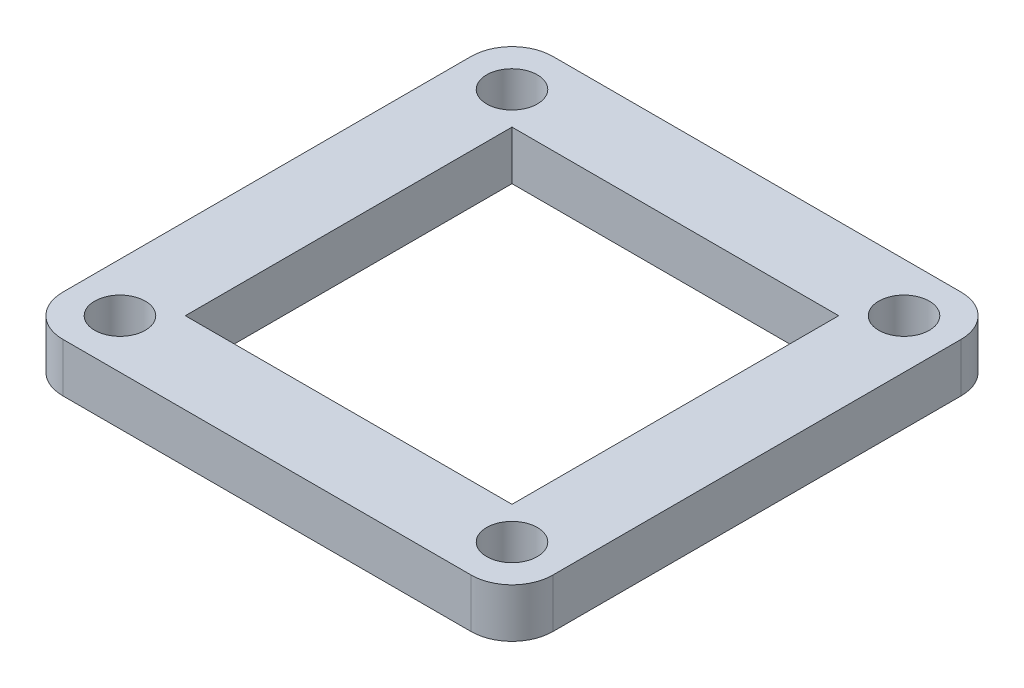
ISO-10303-21;
HEADER;
FILE_DESCRIPTION(('STEP AP214'),'2;1');
FILE_NAME('part.step','',(''),(''),'','','');
FILE_SCHEMA(('AUTOMOTIVE_DESIGN { 1 0 10303 214 1 1 1 1 }'));
ENDSEC;
DATA;
#1=APPLICATION_CONTEXT('core data for automotive mechanical design processes');
#2=APPLICATION_PROTOCOL_DEFINITION('international standard','automotive_design',2000,#1);
#3=PRODUCT_CONTEXT('',#1,'mechanical');
#4=PRODUCT('Part','Part','',(#3));
#5=PRODUCT_RELATED_PRODUCT_CATEGORY('part','',(#4));
#6=PRODUCT_DEFINITION_FORMATION('','',#4);
#7=PRODUCT_DEFINITION_CONTEXT('part definition',#1,'design');
#8=PRODUCT_DEFINITION('design','',#6,#7);
#9=PRODUCT_DEFINITION_SHAPE('','',#8);
#10=(LENGTH_UNIT() NAMED_UNIT(*) SI_UNIT(.MILLI.,.METRE.));
#11=(NAMED_UNIT(*) PLANE_ANGLE_UNIT() SI_UNIT($,.RADIAN.));
#12=(NAMED_UNIT(*) SI_UNIT($,.STERADIAN.) SOLID_ANGLE_UNIT());
#13=UNCERTAINTY_MEASURE_WITH_UNIT(LENGTH_MEASURE(1.E-05),#10,'distance_accuracy_value','');
#14=(GEOMETRIC_REPRESENTATION_CONTEXT(3) GLOBAL_UNCERTAINTY_ASSIGNED_CONTEXT((#13)) GLOBAL_UNIT_ASSIGNED_CONTEXT((#10,
#11,#12)) REPRESENTATION_CONTEXT('',''));
#15=CARTESIAN_POINT('',(0.,0.,0.));
#16=DIRECTION('',(0.,0.,1.));
#17=DIRECTION('',(1.,0.,0.));
#18=AXIS2_PLACEMENT_3D('',#15,#16,#17);
#19=CARTESIAN_POINT('',(0.,3.,0.));
#20=DIRECTION('',(0.,-1.,0.));
#21=DIRECTION('',(0.,0.,-1.));
#22=AXIS2_PLACEMENT_3D('',#19,#20,#21);
#23=PLANE('',#22);
#24=CARTESIAN_POINT('',(-12.,3.,12.0000000000002));
#25=DIRECTION('',(0.,1.,0.));
#26=DIRECTION('',(0.,0.,1.));
#27=AXIS2_PLACEMENT_3D('',#24,#25,#26);
#28=CIRCLE('',#27,1.55);
#29=CARTESIAN_POINT('',(-12.,3.,13.5500000000002));
#30=VERTEX_POINT('',#29);
#31=EDGE_CURVE('E166',#30,#30,#28,.T.);
#32=ORIENTED_EDGE('',*,*,#31,.F.);
#33=EDGE_LOOP('',(#32));
#34=FACE_BOUND('',#33,.T.);
#35=CARTESIAN_POINT('',(-12.,3.,-11.9999999999998));
#36=DIRECTION('',(0.,1.,0.));
#37=DIRECTION('',(0.,0.,1.));
#38=AXIS2_PLACEMENT_3D('',#35,#36,#37);
#39=CIRCLE('',#38,1.55);
#40=CARTESIAN_POINT('',(-12.,3.,-10.4499999999998));
#41=VERTEX_POINT('',#40);
#42=EDGE_CURVE('E172',#41,#41,#39,.T.);
#43=ORIENTED_EDGE('',*,*,#42,.F.);
#44=EDGE_LOOP('',(#43));
#45=FACE_BOUND('',#44,.T.);
#46=CARTESIAN_POINT('',(12.,3.,12.));
#47=DIRECTION('',(0.,1.,0.));
#48=DIRECTION('',(0.,0.,1.));
#49=AXIS2_PLACEMENT_3D('',#46,#47,#48);
#50=CIRCLE('',#49,1.55);
#51=CARTESIAN_POINT('',(12.,3.,13.55));
#52=VERTEX_POINT('',#51);
#53=EDGE_CURVE('E178',#52,#52,#50,.T.);
#54=ORIENTED_EDGE('',*,*,#53,.F.);
#55=EDGE_LOOP('',(#54));
#56=FACE_BOUND('',#55,.T.);
#57=CARTESIAN_POINT('',(12.,3.,-12.));
#58=DIRECTION('',(0.,1.,0.));
#59=DIRECTION('',(0.,0.,1.));
#60=AXIS2_PLACEMENT_3D('',#57,#58,#59);
#61=CIRCLE('',#60,1.55);
#62=CARTESIAN_POINT('',(12.,3.,-10.45));
#63=VERTEX_POINT('',#62);
#64=EDGE_CURVE('E184',#63,#63,#61,.T.);
#65=ORIENTED_EDGE('',*,*,#64,.F.);
#66=EDGE_LOOP('',(#65));
#67=FACE_BOUND('',#66,.T.);
#68=DIRECTION('',(-1.,0.,0.));
#69=VECTOR('',#68,1.);
#70=CARTESIAN_POINT('',(-15.,3.,-15.));
#71=LINE('',#70,#69);
#72=CARTESIAN_POINT('',(12.5,3.,-15.));
#73=VERTEX_POINT('',#72);
#74=CARTESIAN_POINT('',(-12.5,3.,-15.));
#75=VERTEX_POINT('',#74);
#76=EDGE_CURVE('E193',#73,#75,#71,.T.);
#77=ORIENTED_EDGE('',*,*,#76,.T.);
#78=CARTESIAN_POINT('',(-12.5,3.,-12.5));
#79=DIRECTION('',(0.,-1.,0.));
#80=DIRECTION('',(0.,0.,-1.));
#81=AXIS2_PLACEMENT_3D('',#78,#79,#80);
#82=CIRCLE('',#81,2.5);
#83=CARTESIAN_POINT('',(-15.,3.,-12.5));
#84=VERTEX_POINT('',#83);
#85=EDGE_CURVE('E233',#75,#84,#82,.F.);
#86=ORIENTED_EDGE('',*,*,#85,.T.);
#87=DIRECTION('',(0.,0.,1.));
#88=VECTOR('',#87,1.);
#89=CARTESIAN_POINT('',(-15.,3.,15.));
#90=LINE('',#89,#88);
#91=CARTESIAN_POINT('',(-15.,3.,12.5));
#92=VERTEX_POINT('',#91);
#93=EDGE_CURVE('E197',#84,#92,#90,.T.);
#94=ORIENTED_EDGE('',*,*,#93,.T.);
#95=CARTESIAN_POINT('',(-12.5,3.,12.5));
#96=DIRECTION('',(0.,-1.,0.));
#97=DIRECTION('',(0.,0.,-1.));
#98=AXIS2_PLACEMENT_3D('',#95,#96,#97);
#99=CIRCLE('',#98,2.5);
#100=CARTESIAN_POINT('',(-12.5,3.,15.));
#101=VERTEX_POINT('',#100);
#102=EDGE_CURVE('E55',#92,#101,#99,.F.);
#103=ORIENTED_EDGE('',*,*,#102,.T.);
#104=DIRECTION('',(1.,0.,0.));
#105=VECTOR('',#104,1.);
#106=CARTESIAN_POINT('',(-15.,3.,15.));
#107=LINE('',#106,#105);
#108=CARTESIAN_POINT('',(12.5,3.,15.));
#109=VERTEX_POINT('',#108);
#110=EDGE_CURVE('E199',#101,#109,#107,.T.);
#111=ORIENTED_EDGE('',*,*,#110,.T.);
#112=CARTESIAN_POINT('',(12.5,3.,12.5));
#113=DIRECTION('',(0.,-1.,0.));
#114=DIRECTION('',(0.,0.,-1.));
#115=AXIS2_PLACEMENT_3D('',#112,#113,#114);
#116=CIRCLE('',#115,2.5);
#117=CARTESIAN_POINT('',(15.,3.,12.5));
#118=VERTEX_POINT('',#117);
#119=EDGE_CURVE('E230',#109,#118,#116,.F.);
#120=ORIENTED_EDGE('',*,*,#119,.T.);
#121=DIRECTION('',(0.,0.,-1.));
#122=VECTOR('',#121,1.);
#123=CARTESIAN_POINT('',(15.,3.,15.));
#124=LINE('',#123,#122);
#125=CARTESIAN_POINT('',(15.,3.,-12.5));
#126=VERTEX_POINT('',#125);
#127=EDGE_CURVE('E190',#118,#126,#124,.T.);
#128=ORIENTED_EDGE('',*,*,#127,.T.);
#129=CARTESIAN_POINT('',(12.5,3.,-12.5));
#130=DIRECTION('',(0.,-1.,0.));
#131=DIRECTION('',(0.,0.,-1.));
#132=AXIS2_PLACEMENT_3D('',#129,#130,#131);
#133=CIRCLE('',#132,2.5);
#134=EDGE_CURVE('E228',#126,#73,#133,.F.);
#135=ORIENTED_EDGE('',*,*,#134,.T.);
#136=EDGE_LOOP('',(#77,#86,#94,#103,#111,#120,#128,#135));
#137=FACE_BOUND('',#136,.T.);
#138=DIRECTION('',(0.,0.,-1.));
#139=VECTOR('',#138,1.);
#140=CARTESIAN_POINT('',(10.,3.,-10.));
#141=LINE('',#140,#139);
#142=CARTESIAN_POINT('',(10.,3.,10.));
#143=VERTEX_POINT('',#142);
#144=CARTESIAN_POINT('',(10.,3.,-10.));
#145=VERTEX_POINT('',#144);
#146=EDGE_CURVE('E125',#143,#145,#141,.T.);
#147=ORIENTED_EDGE('',*,*,#146,.F.);
#148=DIRECTION('',(1.,0.,0.));
#149=VECTOR('',#148,1.);
#150=CARTESIAN_POINT('',(-10.,3.,10.));
#151=LINE('',#150,#149);
#152=CARTESIAN_POINT('',(-10.,3.,10.));
#153=VERTEX_POINT('',#152);
#154=EDGE_CURVE('E150',#153,#143,#151,.T.);
#155=ORIENTED_EDGE('',*,*,#154,.F.);
#156=DIRECTION('',(0.,0.,1.));
#157=VECTOR('',#156,1.);
#158=CARTESIAN_POINT('',(-10.,3.,-10.));
#159=LINE('',#158,#157);
#160=CARTESIAN_POINT('',(-10.,3.,-10.));
#161=VERTEX_POINT('',#160);
#162=EDGE_CURVE('E148',#161,#153,#159,.T.);
#163=ORIENTED_EDGE('',*,*,#162,.F.);
#164=DIRECTION('',(-1.,0.,0.));
#165=VECTOR('',#164,1.);
#166=CARTESIAN_POINT('',(-10.,3.,-10.));
#167=LINE('',#166,#165);
#168=EDGE_CURVE('E135',#145,#161,#167,.T.);
#169=ORIENTED_EDGE('',*,*,#168,.F.);
#170=EDGE_LOOP('',(#147,#155,#163,#169));
#171=FACE_BOUND('',#170,.T.);
#172=ADVANCED_FACE('F33',(#34,#45,#56,#67,#137,#171),#23,.F.);
#173=CARTESIAN_POINT('',(0.,0.,0.));
#174=DIRECTION('',(0.,-1.,0.));
#175=DIRECTION('',(0.,0.,-1.));
#176=AXIS2_PLACEMENT_3D('',#173,#174,#175);
#177=PLANE('',#176);
#178=CARTESIAN_POINT('',(-12.,0.,-11.9999999999998));
#179=DIRECTION('',(0.,1.,0.));
#180=DIRECTION('',(0.,0.,1.));
#181=AXIS2_PLACEMENT_3D('',#178,#179,#180);
#182=CIRCLE('',#181,1.55);
#183=CARTESIAN_POINT('',(-12.,0.,-10.4499999999998));
#184=VERTEX_POINT('',#183);
#185=EDGE_CURVE('E169',#184,#184,#182,.T.);
#186=ORIENTED_EDGE('',*,*,#185,.T.);
#187=EDGE_LOOP('',(#186));
#188=FACE_BOUND('',#187,.T.);
#189=CARTESIAN_POINT('',(12.,0.,-12.));
#190=DIRECTION('',(0.,1.,0.));
#191=DIRECTION('',(0.,0.,1.));
#192=AXIS2_PLACEMENT_3D('',#189,#190,#191);
#193=CIRCLE('',#192,1.55);
#194=CARTESIAN_POINT('',(12.,0.,-10.45));
#195=VERTEX_POINT('',#194);
#196=EDGE_CURVE('E181',#195,#195,#193,.T.);
#197=ORIENTED_EDGE('',*,*,#196,.T.);
#198=EDGE_LOOP('',(#197));
#199=FACE_BOUND('',#198,.T.);
#200=DIRECTION('',(0.,0.,1.));
#201=VECTOR('',#200,1.);
#202=CARTESIAN_POINT('',(-15.,0.,15.));
#203=LINE('',#202,#201);
#204=CARTESIAN_POINT('',(-15.,0.,-12.5));
#205=VERTEX_POINT('',#204);
#206=CARTESIAN_POINT('',(-15.,0.,12.5));
#207=VERTEX_POINT('',#206);
#208=EDGE_CURVE('E207',#205,#207,#203,.T.);
#209=ORIENTED_EDGE('',*,*,#208,.F.);
#210=CARTESIAN_POINT('',(-12.5,0.,-12.5));
#211=DIRECTION('',(0.,-1.,0.));
#212=DIRECTION('',(0.,0.,-1.));
#213=AXIS2_PLACEMENT_3D('',#210,#211,#212);
#214=CIRCLE('',#213,2.5);
#215=CARTESIAN_POINT('',(-12.5,0.,-15.));
#216=VERTEX_POINT('',#215);
#217=EDGE_CURVE('E221',#205,#216,#214,.T.);
#218=ORIENTED_EDGE('',*,*,#217,.T.);
#219=DIRECTION('',(-1.,0.,0.));
#220=VECTOR('',#219,1.);
#221=CARTESIAN_POINT('',(-15.,0.,-15.));
#222=LINE('',#221,#220);
#223=CARTESIAN_POINT('',(12.5,0.,-15.));
#224=VERTEX_POINT('',#223);
#225=EDGE_CURVE('E204',#224,#216,#222,.T.);
#226=ORIENTED_EDGE('',*,*,#225,.F.);
#227=CARTESIAN_POINT('',(12.5,0.,-12.5));
#228=DIRECTION('',(0.,-1.,0.));
#229=DIRECTION('',(0.,0.,-1.));
#230=AXIS2_PLACEMENT_3D('',#227,#228,#229);
#231=CIRCLE('',#230,2.5);
#232=CARTESIAN_POINT('',(15.,0.,-12.5));
#233=VERTEX_POINT('',#232);
#234=EDGE_CURVE('E215',#224,#233,#231,.T.);
#235=ORIENTED_EDGE('',*,*,#234,.T.);
#236=DIRECTION('',(0.,0.,-1.));
#237=VECTOR('',#236,1.);
#238=CARTESIAN_POINT('',(15.,0.,15.));
#239=LINE('',#238,#237);
#240=CARTESIAN_POINT('',(15.,0.,12.5));
#241=VERTEX_POINT('',#240);
#242=EDGE_CURVE('E187',#241,#233,#239,.T.);
#243=ORIENTED_EDGE('',*,*,#242,.F.);
#244=CARTESIAN_POINT('',(12.5,0.,12.5));
#245=DIRECTION('',(0.,-1.,0.));
#246=DIRECTION('',(0.,0.,-1.));
#247=AXIS2_PLACEMENT_3D('',#244,#245,#246);
#248=CIRCLE('',#247,2.5);
#249=CARTESIAN_POINT('',(12.5,0.,15.));
#250=VERTEX_POINT('',#249);
#251=EDGE_CURVE('E217',#241,#250,#248,.T.);
#252=ORIENTED_EDGE('',*,*,#251,.T.);
#253=DIRECTION('',(1.,0.,0.));
#254=VECTOR('',#253,1.);
#255=CARTESIAN_POINT('',(-15.,0.,15.));
#256=LINE('',#255,#254);
#257=CARTESIAN_POINT('',(-12.5,0.,15.));
#258=VERTEX_POINT('',#257);
#259=EDGE_CURVE('E194',#258,#250,#256,.T.);
#260=ORIENTED_EDGE('',*,*,#259,.F.);
#261=CARTESIAN_POINT('',(-12.5,0.,12.5));
#262=DIRECTION('',(0.,-1.,0.));
#263=DIRECTION('',(0.,0.,-1.));
#264=AXIS2_PLACEMENT_3D('',#261,#262,#263);
#265=CIRCLE('',#264,2.5);
#266=EDGE_CURVE('E219',#258,#207,#265,.T.);
#267=ORIENTED_EDGE('',*,*,#266,.T.);
#268=EDGE_LOOP('',(#209,#218,#226,#235,#243,#252,#260,#267));
#269=FACE_BOUND('',#268,.T.);
#270=CARTESIAN_POINT('',(12.,0.,12.));
#271=DIRECTION('',(0.,1.,0.));
#272=DIRECTION('',(0.,0.,1.));
#273=AXIS2_PLACEMENT_3D('',#270,#271,#272);
#274=CIRCLE('',#273,1.55);
#275=CARTESIAN_POINT('',(12.,0.,13.55));
#276=VERTEX_POINT('',#275);
#277=EDGE_CURVE('E175',#276,#276,#274,.T.);
#278=ORIENTED_EDGE('',*,*,#277,.T.);
#279=EDGE_LOOP('',(#278));
#280=FACE_BOUND('',#279,.T.);
#281=CARTESIAN_POINT('',(-12.,0.,12.0000000000002));
#282=DIRECTION('',(0.,1.,0.));
#283=DIRECTION('',(0.,0.,1.));
#284=AXIS2_PLACEMENT_3D('',#281,#282,#283);
#285=CIRCLE('',#284,1.55);
#286=CARTESIAN_POINT('',(-12.,0.,13.5500000000002));
#287=VERTEX_POINT('',#286);
#288=EDGE_CURVE('E143',#287,#287,#285,.T.);
#289=ORIENTED_EDGE('',*,*,#288,.T.);
#290=EDGE_LOOP('',(#289));
#291=FACE_BOUND('',#290,.T.);
#292=DIRECTION('',(1.,0.,0.));
#293=VECTOR('',#292,1.);
#294=CARTESIAN_POINT('',(-10.,0.,10.));
#295=LINE('',#294,#293);
#296=CARTESIAN_POINT('',(-10.,0.,10.));
#297=VERTEX_POINT('',#296);
#298=CARTESIAN_POINT('',(10.,0.,10.));
#299=VERTEX_POINT('',#298);
#300=EDGE_CURVE('E136',#297,#299,#295,.T.);
#301=ORIENTED_EDGE('',*,*,#300,.T.);
#302=DIRECTION('',(0.,0.,-1.));
#303=VECTOR('',#302,1.);
#304=CARTESIAN_POINT('',(10.,0.,-10.));
#305=LINE('',#304,#303);
#306=CARTESIAN_POINT('',(10.,0.,-10.));
#307=VERTEX_POINT('',#306);
#308=EDGE_CURVE('E154',#299,#307,#305,.T.);
#309=ORIENTED_EDGE('',*,*,#308,.T.);
#310=DIRECTION('',(-1.,0.,0.));
#311=VECTOR('',#310,1.);
#312=CARTESIAN_POINT('',(-10.,0.,-10.));
#313=LINE('',#312,#311);
#314=CARTESIAN_POINT('',(-10.,0.,-10.));
#315=VERTEX_POINT('',#314);
#316=EDGE_CURVE('E142',#307,#315,#313,.T.);
#317=ORIENTED_EDGE('',*,*,#316,.T.);
#318=DIRECTION('',(0.,0.,1.));
#319=VECTOR('',#318,1.);
#320=CARTESIAN_POINT('',(-10.,0.,-10.));
#321=LINE('',#320,#319);
#322=EDGE_CURVE('E157',#315,#297,#321,.T.);
#323=ORIENTED_EDGE('',*,*,#322,.T.);
#324=EDGE_LOOP('',(#301,#309,#317,#323));
#325=FACE_BOUND('',#324,.T.);
#326=ADVANCED_FACE('F255',(#188,#199,#269,#280,#291,#325),#177,.T.);
#327=CARTESIAN_POINT('',(15.,3.,15.));
#328=DIRECTION('',(-1.,0.,0.));
#329=DIRECTION('',(0.,0.,1.));
#330=AXIS2_PLACEMENT_3D('',#327,#328,#329);
#331=PLANE('',#330);
#332=ORIENTED_EDGE('',*,*,#127,.F.);
#333=DIRECTION('',(0.,-1.,0.));
#334=VECTOR('',#333,1.);
#335=CARTESIAN_POINT('',(15.,3.,12.5));
#336=LINE('',#335,#334);
#337=EDGE_CURVE('E11',#118,#241,#336,.T.);
#338=ORIENTED_EDGE('',*,*,#337,.T.);
#339=ORIENTED_EDGE('',*,*,#242,.T.);
#340=DIRECTION('',(0.,-1.,0.));
#341=VECTOR('',#340,1.);
#342=CARTESIAN_POINT('',(15.,3.,-12.5));
#343=LINE('',#342,#341);
#344=EDGE_CURVE('E41',#233,#126,#343,.F.);
#345=ORIENTED_EDGE('',*,*,#344,.T.);
#346=EDGE_LOOP('',(#332,#338,#339,#345));
#347=FACE_BOUND('',#346,.T.);
#348=ADVANCED_FACE('F241',(#347),#331,.F.);
#349=CARTESIAN_POINT('',(-15.,3.,-15.));
#350=DIRECTION('',(0.,0.,1.));
#351=DIRECTION('',(1.,0.,0.));
#352=AXIS2_PLACEMENT_3D('',#349,#350,#351);
#353=PLANE('',#352);
#354=ORIENTED_EDGE('',*,*,#225,.T.);
#355=DIRECTION('',(0.,-1.,0.));
#356=VECTOR('',#355,1.);
#357=CARTESIAN_POINT('',(-12.5,3.,-15.));
#358=LINE('',#357,#356);
#359=EDGE_CURVE('E226',#216,#75,#358,.F.);
#360=ORIENTED_EDGE('',*,*,#359,.T.);
#361=ORIENTED_EDGE('',*,*,#76,.F.);
#362=DIRECTION('',(0.,-1.,0.));
#363=VECTOR('',#362,1.);
#364=CARTESIAN_POINT('',(12.5,3.,-15.));
#365=LINE('',#364,#363);
#366=EDGE_CURVE('E223',#73,#224,#365,.T.);
#367=ORIENTED_EDGE('',*,*,#366,.T.);
#368=EDGE_LOOP('',(#354,#360,#361,#367));
#369=FACE_BOUND('',#368,.T.);
#370=ADVANCED_FACE('F251',(#369),#353,.F.);
#371=CARTESIAN_POINT('',(-15.,3.,15.));
#372=DIRECTION('',(1.,0.,0.));
#373=DIRECTION('',(0.,0.,-1.));
#374=AXIS2_PLACEMENT_3D('',#371,#372,#373);
#375=PLANE('',#374);
#376=ORIENTED_EDGE('',*,*,#93,.F.);
#377=DIRECTION('',(0.,-1.,0.));
#378=VECTOR('',#377,1.);
#379=CARTESIAN_POINT('',(-15.,3.,-12.5));
#380=LINE('',#379,#378);
#381=EDGE_CURVE('E212',#84,#205,#380,.T.);
#382=ORIENTED_EDGE('',*,*,#381,.T.);
#383=ORIENTED_EDGE('',*,*,#208,.T.);
#384=DIRECTION('',(0.,-1.,0.));
#385=VECTOR('',#384,1.);
#386=CARTESIAN_POINT('',(-15.,3.,12.5));
#387=LINE('',#386,#385);
#388=EDGE_CURVE('E201',#207,#92,#387,.F.);
#389=ORIENTED_EDGE('',*,*,#388,.T.);
#390=EDGE_LOOP('',(#376,#382,#383,#389));
#391=FACE_BOUND('',#390,.T.);
#392=ADVANCED_FACE('F263',(#391),#375,.F.);
#393=CARTESIAN_POINT('',(-15.,3.,15.));
#394=DIRECTION('',(0.,0.,-1.));
#395=DIRECTION('',(-1.,0.,0.));
#396=AXIS2_PLACEMENT_3D('',#393,#394,#395);
#397=PLANE('',#396);
#398=ORIENTED_EDGE('',*,*,#110,.F.);
#399=DIRECTION('',(0.,-1.,0.));
#400=VECTOR('',#399,1.);
#401=CARTESIAN_POINT('',(-12.5,3.,15.));
#402=LINE('',#401,#400);
#403=EDGE_CURVE('E236',#101,#258,#402,.T.);
#404=ORIENTED_EDGE('',*,*,#403,.T.);
#405=ORIENTED_EDGE('',*,*,#259,.T.);
#406=DIRECTION('',(0.,-1.,0.));
#407=VECTOR('',#406,1.);
#408=CARTESIAN_POINT('',(12.5,3.,15.));
#409=LINE('',#408,#407);
#410=EDGE_CURVE('E48',#250,#109,#409,.F.);
#411=ORIENTED_EDGE('',*,*,#410,.T.);
#412=EDGE_LOOP('',(#398,#404,#405,#411));
#413=FACE_BOUND('',#412,.T.);
#414=ADVANCED_FACE('F269',(#413),#397,.F.);
#415=CARTESIAN_POINT('',(12.,3.,-12.));
#416=DIRECTION('',(0.,-1.,0.));
#417=DIRECTION('',(0.,0.,-1.));
#418=AXIS2_PLACEMENT_3D('',#415,#416,#417);
#419=CYLINDRICAL_SURFACE('',#418,1.55);
#420=ORIENTED_EDGE('',*,*,#64,.T.);
#421=EDGE_LOOP('',(#420));
#422=FACE_BOUND('',#421,.T.);
#423=ORIENTED_EDGE('',*,*,#196,.F.);
#424=EDGE_LOOP('',(#423));
#425=FACE_BOUND('',#424,.T.);
#426=ADVANCED_FACE('F289',(#422,#425),#419,.F.);
#427=CARTESIAN_POINT('',(12.,3.,12.));
#428=DIRECTION('',(0.,-1.,0.));
#429=DIRECTION('',(0.,0.,-1.));
#430=AXIS2_PLACEMENT_3D('',#427,#428,#429);
#431=CYLINDRICAL_SURFACE('',#430,1.55);
#432=ORIENTED_EDGE('',*,*,#53,.T.);
#433=EDGE_LOOP('',(#432));
#434=FACE_BOUND('',#433,.T.);
#435=ORIENTED_EDGE('',*,*,#277,.F.);
#436=EDGE_LOOP('',(#435));
#437=FACE_BOUND('',#436,.T.);
#438=ADVANCED_FACE('F325',(#434,#437),#431,.F.);
#439=CARTESIAN_POINT('',(-12.,3.,-11.9999999999998));
#440=DIRECTION('',(0.,-1.,0.));
#441=DIRECTION('',(0.,0.,-1.));
#442=AXIS2_PLACEMENT_3D('',#439,#440,#441);
#443=CYLINDRICAL_SURFACE('',#442,1.55);
#444=ORIENTED_EDGE('',*,*,#42,.T.);
#445=EDGE_LOOP('',(#444));
#446=FACE_BOUND('',#445,.T.);
#447=ORIENTED_EDGE('',*,*,#185,.F.);
#448=EDGE_LOOP('',(#447));
#449=FACE_BOUND('',#448,.T.);
#450=ADVANCED_FACE('F322',(#446,#449),#443,.F.);
#451=CARTESIAN_POINT('',(-12.,3.,12.0000000000002));
#452=DIRECTION('',(0.,-1.,0.));
#453=DIRECTION('',(0.,0.,-1.));
#454=AXIS2_PLACEMENT_3D('',#451,#452,#453);
#455=CYLINDRICAL_SURFACE('',#454,1.55);
#456=ORIENTED_EDGE('',*,*,#31,.T.);
#457=EDGE_LOOP('',(#456));
#458=FACE_BOUND('',#457,.T.);
#459=ORIENTED_EDGE('',*,*,#288,.F.);
#460=EDGE_LOOP('',(#459));
#461=FACE_BOUND('',#460,.T.);
#462=ADVANCED_FACE('F319',(#458,#461),#455,.F.);
#463=CARTESIAN_POINT('',(10.,3.,-10.));
#464=DIRECTION('',(-1.,0.,0.));
#465=DIRECTION('',(0.,0.,1.));
#466=AXIS2_PLACEMENT_3D('',#463,#464,#465);
#467=PLANE('',#466);
#468=ORIENTED_EDGE('',*,*,#308,.F.);
#469=DIRECTION('',(0.,-1.,0.));
#470=VECTOR('',#469,1.);
#471=CARTESIAN_POINT('',(10.,3.,10.));
#472=LINE('',#471,#470);
#473=EDGE_CURVE('E131',#143,#299,#472,.T.);
#474=ORIENTED_EDGE('',*,*,#473,.F.);
#475=ORIENTED_EDGE('',*,*,#146,.T.);
#476=DIRECTION('',(0.,-1.,0.));
#477=VECTOR('',#476,1.);
#478=CARTESIAN_POINT('',(10.,3.,-10.));
#479=LINE('',#478,#477);
#480=EDGE_CURVE('E128',#145,#307,#479,.T.);
#481=ORIENTED_EDGE('',*,*,#480,.T.);
#482=EDGE_LOOP('',(#468,#474,#475,#481));
#483=FACE_BOUND('',#482,.T.);
#484=ADVANCED_FACE('F127',(#483),#467,.T.);
#485=CARTESIAN_POINT('',(-10.,3.,-10.));
#486=DIRECTION('',(0.,0.,1.));
#487=DIRECTION('',(1.,0.,0.));
#488=AXIS2_PLACEMENT_3D('',#485,#486,#487);
#489=PLANE('',#488);
#490=ORIENTED_EDGE('',*,*,#316,.F.);
#491=ORIENTED_EDGE('',*,*,#480,.F.);
#492=ORIENTED_EDGE('',*,*,#168,.T.);
#493=DIRECTION('',(0.,-1.,0.));
#494=VECTOR('',#493,1.);
#495=CARTESIAN_POINT('',(-10.,3.,-10.));
#496=LINE('',#495,#494);
#497=EDGE_CURVE('E144',#161,#315,#496,.T.);
#498=ORIENTED_EDGE('',*,*,#497,.T.);
#499=EDGE_LOOP('',(#490,#491,#492,#498));
#500=FACE_BOUND('',#499,.T.);
#501=ADVANCED_FACE('F139',(#500),#489,.T.);
#502=CARTESIAN_POINT('',(-10.,3.,-10.));
#503=DIRECTION('',(1.,0.,0.));
#504=DIRECTION('',(0.,0.,-1.));
#505=AXIS2_PLACEMENT_3D('',#502,#503,#504);
#506=PLANE('',#505);
#507=ORIENTED_EDGE('',*,*,#322,.F.);
#508=ORIENTED_EDGE('',*,*,#497,.F.);
#509=ORIENTED_EDGE('',*,*,#162,.T.);
#510=DIRECTION('',(0.,-1.,0.));
#511=VECTOR('',#510,1.);
#512=CARTESIAN_POINT('',(-10.,3.,10.));
#513=LINE('',#512,#511);
#514=EDGE_CURVE('E163',#153,#297,#513,.T.);
#515=ORIENTED_EDGE('',*,*,#514,.T.);
#516=EDGE_LOOP('',(#507,#508,#509,#515));
#517=FACE_BOUND('',#516,.T.);
#518=ADVANCED_FACE('F305',(#517),#506,.T.);
#519=CARTESIAN_POINT('',(-10.,3.,10.));
#520=DIRECTION('',(0.,0.,-1.));
#521=DIRECTION('',(-1.,0.,0.));
#522=AXIS2_PLACEMENT_3D('',#519,#520,#521);
#523=PLANE('',#522);
#524=ORIENTED_EDGE('',*,*,#300,.F.);
#525=ORIENTED_EDGE('',*,*,#514,.F.);
#526=ORIENTED_EDGE('',*,*,#154,.T.);
#527=ORIENTED_EDGE('',*,*,#473,.T.);
#528=EDGE_LOOP('',(#524,#525,#526,#527));
#529=FACE_BOUND('',#528,.T.);
#530=ADVANCED_FACE('F301',(#529),#523,.T.);
#531=CARTESIAN_POINT('',(-12.5,3.,-12.5));
#532=DIRECTION('',(0.,-1.,0.));
#533=DIRECTION('',(0.,0.,-1.));
#534=AXIS2_PLACEMENT_3D('',#531,#532,#533);
#535=CYLINDRICAL_SURFACE('',#534,2.5);
#536=ORIENTED_EDGE('',*,*,#85,.F.);
#537=ORIENTED_EDGE('',*,*,#359,.F.);
#538=ORIENTED_EDGE('',*,*,#217,.F.);
#539=ORIENTED_EDGE('',*,*,#381,.F.);
#540=EDGE_LOOP('',(#536,#537,#538,#539));
#541=FACE_BOUND('',#540,.T.);
#542=ADVANCED_FACE('F260',(#541),#535,.T.);
#543=CARTESIAN_POINT('',(-12.5,3.,12.5));
#544=DIRECTION('',(0.,-1.,0.));
#545=DIRECTION('',(0.,0.,-1.));
#546=AXIS2_PLACEMENT_3D('',#543,#544,#545);
#547=CYLINDRICAL_SURFACE('',#546,2.5);
#548=ORIENTED_EDGE('',*,*,#102,.F.);
#549=ORIENTED_EDGE('',*,*,#388,.F.);
#550=ORIENTED_EDGE('',*,*,#266,.F.);
#551=ORIENTED_EDGE('',*,*,#403,.F.);
#552=EDGE_LOOP('',(#548,#549,#550,#551));
#553=FACE_BOUND('',#552,.T.);
#554=ADVANCED_FACE('F267',(#553),#547,.T.);
#555=CARTESIAN_POINT('',(12.5,3.,12.5));
#556=DIRECTION('',(0.,-1.,0.));
#557=DIRECTION('',(0.,0.,-1.));
#558=AXIS2_PLACEMENT_3D('',#555,#556,#557);
#559=CYLINDRICAL_SURFACE('',#558,2.5);
#560=ORIENTED_EDGE('',*,*,#119,.F.);
#561=ORIENTED_EDGE('',*,*,#410,.F.);
#562=ORIENTED_EDGE('',*,*,#251,.F.);
#563=ORIENTED_EDGE('',*,*,#337,.F.);
#564=EDGE_LOOP('',(#560,#561,#562,#563));
#565=FACE_BOUND('',#564,.T.);
#566=ADVANCED_FACE('F271',(#565),#559,.T.);
#567=CARTESIAN_POINT('',(12.5,3.,-12.5));
#568=DIRECTION('',(0.,-1.,0.));
#569=DIRECTION('',(0.,0.,-1.));
#570=AXIS2_PLACEMENT_3D('',#567,#568,#569);
#571=CYLINDRICAL_SURFACE('',#570,2.5);
#572=ORIENTED_EDGE('',*,*,#134,.F.);
#573=ORIENTED_EDGE('',*,*,#344,.F.);
#574=ORIENTED_EDGE('',*,*,#234,.F.);
#575=ORIENTED_EDGE('',*,*,#366,.F.);
#576=EDGE_LOOP('',(#572,#573,#574,#575));
#577=FACE_BOUND('',#576,.T.);
#578=ADVANCED_FACE('F35',(#577),#571,.T.);
#579=CLOSED_SHELL('',(#172,#326,#348,#370,#392,#414,#426,#438,#450,#462,#484,#501,#518,#530,
#542,#554,#566,#578));
#580=MANIFOLD_SOLID_BREP('B2',#579);
#581=ADVANCED_BREP_SHAPE_REPRESENTATION('',(#18,#580),#14);
#582=SHAPE_DEFINITION_REPRESENTATION(#9,#581);
ENDSEC;
END-ISO-10303-21;
